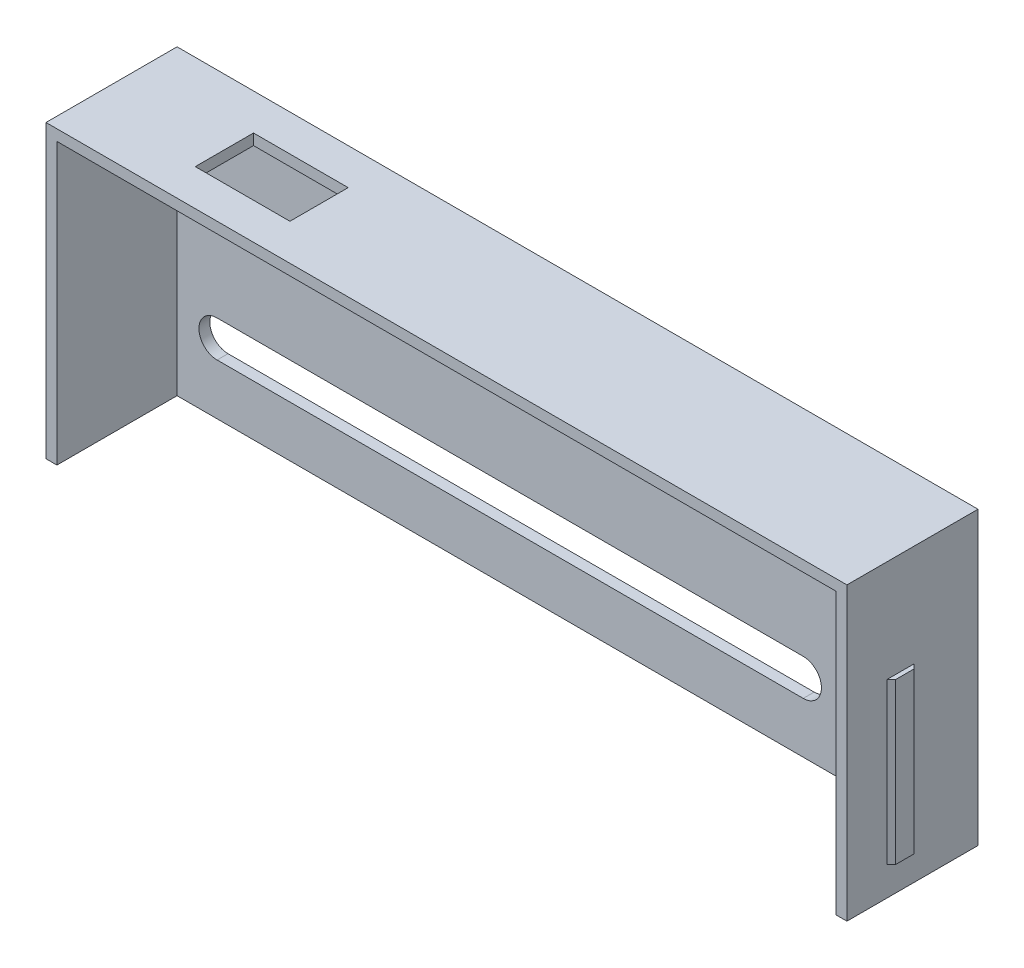
ISO-10303-21;
HEADER;
FILE_DESCRIPTION(('STEP AP214'),'2;1');
FILE_NAME('part.step','',(''),(''),'','','');
FILE_SCHEMA(('AUTOMOTIVE_DESIGN { 1 0 10303 214 1 1 1 1 }'));
ENDSEC;
DATA;
#1=APPLICATION_CONTEXT('core data for automotive mechanical design processes');
#2=APPLICATION_PROTOCOL_DEFINITION('international standard','automotive_design',2000,#1);
#3=PRODUCT_CONTEXT('',#1,'mechanical');
#4=PRODUCT('Part','Part','',(#3));
#5=PRODUCT_RELATED_PRODUCT_CATEGORY('part','',(#4));
#6=PRODUCT_DEFINITION_FORMATION('','',#4);
#7=PRODUCT_DEFINITION_CONTEXT('part definition',#1,'design');
#8=PRODUCT_DEFINITION('design','',#6,#7);
#9=PRODUCT_DEFINITION_SHAPE('','',#8);
#10=(LENGTH_UNIT() NAMED_UNIT(*) SI_UNIT(.MILLI.,.METRE.));
#11=(NAMED_UNIT(*) PLANE_ANGLE_UNIT() SI_UNIT($,.RADIAN.));
#12=(NAMED_UNIT(*) SI_UNIT($,.STERADIAN.) SOLID_ANGLE_UNIT());
#13=UNCERTAINTY_MEASURE_WITH_UNIT(LENGTH_MEASURE(1.E-05),#10,'distance_accuracy_value','');
#14=(GEOMETRIC_REPRESENTATION_CONTEXT(3) GLOBAL_UNCERTAINTY_ASSIGNED_CONTEXT((#13)) GLOBAL_UNIT_ASSIGNED_CONTEXT((#10,
#11,#12)) REPRESENTATION_CONTEXT('',''));
#15=CARTESIAN_POINT('',(0.,0.,0.));
#16=DIRECTION('',(0.,0.,1.));
#17=DIRECTION('',(1.,0.,0.));
#18=AXIS2_PLACEMENT_3D('',#15,#16,#17);
#19=CARTESIAN_POINT('',(109.999999403954,0.,17.9999992251396));
#20=DIRECTION('',(1.,0.,0.));
#21=DIRECTION('',(0.,0.,-1.));
#22=AXIS2_PLACEMENT_3D('',#19,#20,#21);
#23=PLANE('',#22);
#24=DIRECTION('',(0.,-1.,0.));
#25=VECTOR('',#24,1.);
#26=CARTESIAN_POINT('',(109.999999403954,26.0000005364418,8.79999995231628));
#27=LINE('',#26,#25);
#28=CARTESIAN_POINT('',(109.999999403954,26.0000005364418,8.79999995231628));
#29=VERTEX_POINT('',#28);
#30=CARTESIAN_POINT('',(109.999999403954,4.00000018998981,8.79999995231628));
#31=VERTEX_POINT('',#30);
#32=EDGE_CURVE('E278',#29,#31,#27,.T.);
#33=ORIENTED_EDGE('',*,*,#32,.T.);
#34=DIRECTION('',(0.,0.,1.));
#35=VECTOR('',#34,1.);
#36=CARTESIAN_POINT('',(109.999999403954,4.00000018998981,8.79999995231628));
#37=LINE('',#36,#35);
#38=CARTESIAN_POINT('',(109.999999403954,4.00000018998981,12.5000001862645));
#39=VERTEX_POINT('',#38);
#40=EDGE_CURVE('E288',#31,#39,#37,.T.);
#41=ORIENTED_EDGE('',*,*,#40,.T.);
#42=DIRECTION('',(0.,1.,0.));
#43=VECTOR('',#42,1.);
#44=CARTESIAN_POINT('',(109.999999403954,26.0000005364418,12.5000001862645));
#45=LINE('',#44,#43);
#46=CARTESIAN_POINT('',(109.999999403954,26.0000005364418,12.500000214763));
#47=VERTEX_POINT('',#46);
#48=EDGE_CURVE('E290',#39,#47,#45,.T.);
#49=ORIENTED_EDGE('',*,*,#48,.T.);
#50=DIRECTION('',(0.,0.,-1.));
#51=VECTOR('',#50,1.);
#52=CARTESIAN_POINT('',(109.999999403954,26.0000005364418,8.79999995231628));
#53=LINE('',#52,#51);
#54=EDGE_CURVE('E283',#47,#29,#53,.T.);
#55=ORIENTED_EDGE('',*,*,#54,.T.);
#56=EDGE_LOOP('',(#33,#41,#49,#55));
#57=FACE_BOUND('',#56,.T.);
#58=DIRECTION('',(0.,-1.,0.));
#59=VECTOR('',#58,1.);
#60=CARTESIAN_POINT('',(109.999999403954,0.,0.));
#61=LINE('',#60,#59);
#62=CARTESIAN_POINT('',(109.999999403954,39.9999991059303,0.));
#63=VERTEX_POINT('',#62);
#64=CARTESIAN_POINT('',(109.999999403954,0.,0.));
#65=VERTEX_POINT('',#64);
#66=EDGE_CURVE('E316',#63,#65,#61,.T.);
#67=ORIENTED_EDGE('',*,*,#66,.F.);
#68=DIRECTION('',(0.,0.,-1.));
#69=VECTOR('',#68,1.);
#70=CARTESIAN_POINT('',(109.999999403954,39.9999991059303,17.9999992251396));
#71=LINE('',#70,#69);
#72=CARTESIAN_POINT('',(109.999999403954,39.9999991059303,17.9999992251396));
#73=VERTEX_POINT('',#72);
#74=EDGE_CURVE('E352',#73,#63,#71,.T.);
#75=ORIENTED_EDGE('',*,*,#74,.F.);
#76=DIRECTION('',(0.,-1.,0.));
#77=VECTOR('',#76,1.);
#78=CARTESIAN_POINT('',(109.999999403954,0.,17.9999992251396));
#79=LINE('',#78,#77);
#80=CARTESIAN_POINT('',(109.999999403954,0.,17.9999992251396));
#81=VERTEX_POINT('',#80);
#82=EDGE_CURVE('E327',#73,#81,#79,.T.);
#83=ORIENTED_EDGE('',*,*,#82,.T.);
#84=DIRECTION('',(0.,0.,-1.));
#85=VECTOR('',#84,1.);
#86=CARTESIAN_POINT('',(109.999999403954,0.,17.9999992251396));
#87=LINE('',#86,#85);
#88=EDGE_CURVE('E341',#81,#65,#87,.T.);
#89=ORIENTED_EDGE('',*,*,#88,.T.);
#90=EDGE_LOOP('',(#67,#75,#83,#89));
#91=FACE_BOUND('',#90,.T.);
#92=ADVANCED_FACE('F43',(#57,#91),#23,.T.);
#93=CARTESIAN_POINT('',(109.999999403954,39.9999991059303,17.9999992251396));
#94=DIRECTION('',(0.,1.,0.));
#95=DIRECTION('',(0.,0.,1.));
#96=AXIS2_PLACEMENT_3D('',#93,#94,#95);
#97=PLANE('',#96);
#98=DIRECTION('',(0.,0.,-1.));
#99=VECTOR('',#98,1.);
#100=CARTESIAN_POINT('',(28.5000008121133,39.9999991059303,12.9999998454005));
#101=LINE('',#100,#99);
#102=CARTESIAN_POINT('',(28.5000008121133,39.9999991059303,12.9999998454005));
#103=VERTEX_POINT('',#102);
#104=CARTESIAN_POINT('',(28.5000008121133,39.9999991059303,4.99999984540045));
#105=VERTEX_POINT('',#104);
#106=EDGE_CURVE('E230',#103,#105,#101,.T.);
#107=ORIENTED_EDGE('',*,*,#106,.F.);
#108=DIRECTION('',(1.,0.,0.));
#109=VECTOR('',#108,1.);
#110=CARTESIAN_POINT('',(15.5000008121133,39.9999991059303,12.9999998454005));
#111=LINE('',#110,#109);
#112=CARTESIAN_POINT('',(15.5000008121133,39.9999991059303,12.9999998454005));
#113=VERTEX_POINT('',#112);
#114=EDGE_CURVE('E240',#113,#103,#111,.T.);
#115=ORIENTED_EDGE('',*,*,#114,.F.);
#116=DIRECTION('',(0.,0.,1.));
#117=VECTOR('',#116,1.);
#118=CARTESIAN_POINT('',(15.5000008121133,39.9999991059303,12.9999998454005));
#119=LINE('',#118,#117);
#120=CARTESIAN_POINT('',(15.5000008121133,39.9999991059303,4.99999984540045));
#121=VERTEX_POINT('',#120);
#122=EDGE_CURVE('E237',#121,#113,#119,.T.);
#123=ORIENTED_EDGE('',*,*,#122,.F.);
#124=DIRECTION('',(-1.,0.,0.));
#125=VECTOR('',#124,1.);
#126=CARTESIAN_POINT('',(15.5000008121133,39.9999991059303,4.99999984540045));
#127=LINE('',#126,#125);
#128=EDGE_CURVE('E234',#105,#121,#127,.T.);
#129=ORIENTED_EDGE('',*,*,#128,.F.);
#130=EDGE_LOOP('',(#107,#115,#123,#129));
#131=FACE_BOUND('',#130,.T.);
#132=DIRECTION('',(1.,0.,0.));
#133=VECTOR('',#132,1.);
#134=CARTESIAN_POINT('',(109.999999403954,39.9999991059303,0.));
#135=LINE('',#134,#133);
#136=CARTESIAN_POINT('',(0.,39.9999991059303,0.));
#137=VERTEX_POINT('',#136);
#138=EDGE_CURVE('E331',#137,#63,#135,.T.);
#139=ORIENTED_EDGE('',*,*,#138,.F.);
#140=DIRECTION('',(0.,0.,-1.));
#141=VECTOR('',#140,1.);
#142=CARTESIAN_POINT('',(0.,39.9999991059303,17.9999992251396));
#143=LINE('',#142,#141);
#144=CARTESIAN_POINT('',(0.,39.9999991059303,17.9999992251396));
#145=VERTEX_POINT('',#144);
#146=EDGE_CURVE('E355',#145,#137,#143,.T.);
#147=ORIENTED_EDGE('',*,*,#146,.F.);
#148=DIRECTION('',(1.,0.,0.));
#149=VECTOR('',#148,1.);
#150=CARTESIAN_POINT('',(109.999999403954,39.9999991059303,17.9999992251396));
#151=LINE('',#150,#149);
#152=EDGE_CURVE('E338',#145,#73,#151,.T.);
#153=ORIENTED_EDGE('',*,*,#152,.T.);
#154=ORIENTED_EDGE('',*,*,#74,.T.);
#155=EDGE_LOOP('',(#139,#147,#153,#154));
#156=FACE_BOUND('',#155,.T.);
#157=ADVANCED_FACE('F410',(#131,#156),#97,.T.);
#158=CARTESIAN_POINT('',(0.,0.,17.9999992251396));
#159=DIRECTION('',(-1.,0.,0.));
#160=DIRECTION('',(0.,0.,1.));
#161=AXIS2_PLACEMENT_3D('',#158,#159,#160);
#162=PLANE('',#161);
#163=DIRECTION('',(0.,-1.,0.));
#164=VECTOR('',#163,1.);
#165=CARTESIAN_POINT('',(0.,26.0000005364418,8.79999995231628));
#166=LINE('',#165,#164);
#167=CARTESIAN_POINT('',(0.,26.0000005364418,8.79999995231628));
#168=VERTEX_POINT('',#167);
#169=CARTESIAN_POINT('',(0.,4.00000018998981,8.79999995231628));
#170=VERTEX_POINT('',#169);
#171=EDGE_CURVE('E308',#168,#170,#166,.T.);
#172=ORIENTED_EDGE('',*,*,#171,.F.);
#173=DIRECTION('',(0.,0.,-1.));
#174=VECTOR('',#173,1.);
#175=CARTESIAN_POINT('',(0.,26.0000005364418,8.79999995231628));
#176=LINE('',#175,#174);
#177=CARTESIAN_POINT('',(0.,26.0000005364418,12.5000001862645));
#178=VERTEX_POINT('',#177);
#179=EDGE_CURVE('E313',#178,#168,#176,.T.);
#180=ORIENTED_EDGE('',*,*,#179,.F.);
#181=DIRECTION('',(0.,1.,0.));
#182=VECTOR('',#181,1.);
#183=CARTESIAN_POINT('',(0.,26.0000005364418,12.5000001862645));
#184=LINE('',#183,#182);
#185=CARTESIAN_POINT('',(0.,4.00000018998981,12.5000001862645));
#186=VERTEX_POINT('',#185);
#187=EDGE_CURVE('E322',#186,#178,#184,.T.);
#188=ORIENTED_EDGE('',*,*,#187,.F.);
#189=DIRECTION('',(0.,0.,1.));
#190=VECTOR('',#189,1.);
#191=CARTESIAN_POINT('',(0.,4.00000018998981,8.79999995231628));
#192=LINE('',#191,#190);
#193=EDGE_CURVE('E319',#170,#186,#192,.T.);
#194=ORIENTED_EDGE('',*,*,#193,.F.);
#195=EDGE_LOOP('',(#172,#180,#188,#194));
#196=FACE_BOUND('',#195,.T.);
#197=DIRECTION('',(0.,1.,0.));
#198=VECTOR('',#197,1.);
#199=CARTESIAN_POINT('',(0.,0.,0.));
#200=LINE('',#199,#198);
#201=CARTESIAN_POINT('',(0.,0.,0.));
#202=VERTEX_POINT('',#201);
#203=EDGE_CURVE('E347',#202,#137,#200,.T.);
#204=ORIENTED_EDGE('',*,*,#203,.F.);
#205=DIRECTION('',(0.,0.,-1.));
#206=VECTOR('',#205,1.);
#207=CARTESIAN_POINT('',(0.,0.,17.9999992251396));
#208=LINE('',#207,#206);
#209=CARTESIAN_POINT('',(0.,0.,17.9999992251396));
#210=VERTEX_POINT('',#209);
#211=EDGE_CURVE('E357',#210,#202,#208,.T.);
#212=ORIENTED_EDGE('',*,*,#211,.F.);
#213=DIRECTION('',(0.,1.,0.));
#214=VECTOR('',#213,1.);
#215=CARTESIAN_POINT('',(0.,0.,17.9999992251396));
#216=LINE('',#215,#214);
#217=EDGE_CURVE('E335',#210,#145,#216,.T.);
#218=ORIENTED_EDGE('',*,*,#217,.T.);
#219=ORIENTED_EDGE('',*,*,#146,.T.);
#220=EDGE_LOOP('',(#204,#212,#218,#219));
#221=FACE_BOUND('',#220,.T.);
#222=ADVANCED_FACE('F416',(#196,#221),#162,.T.);
#223=CARTESIAN_POINT('',(109.999999403954,0.,17.9999992251396));
#224=DIRECTION('',(0.,-1.,0.));
#225=DIRECTION('',(0.,0.,-1.));
#226=AXIS2_PLACEMENT_3D('',#223,#224,#225);
#227=PLANE('',#226);
#228=DIRECTION('',(0.,0.,1.));
#229=VECTOR('',#228,1.);
#230=CARTESIAN_POINT('',(108.499999403954,0.,-113.715653291896));
#231=LINE('',#230,#229);
#232=CARTESIAN_POINT('',(108.499999403954,0.,1.5));
#233=VERTEX_POINT('',#232);
#234=CARTESIAN_POINT('',(108.499999403954,0.,17.9999992251396));
#235=VERTEX_POINT('',#234);
#236=EDGE_CURVE('E270',#233,#235,#231,.T.);
#237=ORIENTED_EDGE('',*,*,#236,.F.);
#238=DIRECTION('',(-1.,0.,0.));
#239=VECTOR('',#238,1.);
#240=CARTESIAN_POINT('',(1.5,0.,1.5));
#241=LINE('',#240,#239);
#242=CARTESIAN_POINT('',(1.5,0.,1.50000000000002));
#243=VERTEX_POINT('',#242);
#244=EDGE_CURVE('E253',#233,#243,#241,.T.);
#245=ORIENTED_EDGE('',*,*,#244,.T.);
#246=DIRECTION('',(0.,0.,1.));
#247=VECTOR('',#246,1.);
#248=CARTESIAN_POINT('',(1.5,0.,-113.715653291896));
#249=LINE('',#248,#247);
#250=CARTESIAN_POINT('',(1.5,0.,17.9999992251396));
#251=VERTEX_POINT('',#250);
#252=EDGE_CURVE('E272',#243,#251,#249,.T.);
#253=ORIENTED_EDGE('',*,*,#252,.T.);
#254=DIRECTION('',(-1.,0.,0.));
#255=VECTOR('',#254,1.);
#256=CARTESIAN_POINT('',(109.999999403954,0.,17.9999992251396));
#257=LINE('',#256,#255);
#258=EDGE_CURVE('E330',#251,#210,#257,.T.);
#259=ORIENTED_EDGE('',*,*,#258,.T.);
#260=ORIENTED_EDGE('',*,*,#211,.T.);
#261=DIRECTION('',(-1.,0.,0.));
#262=VECTOR('',#261,1.);
#263=CARTESIAN_POINT('',(109.999999403954,0.,0.));
#264=LINE('',#263,#262);
#265=EDGE_CURVE('E344',#65,#202,#264,.T.);
#266=ORIENTED_EDGE('',*,*,#265,.F.);
#267=ORIENTED_EDGE('',*,*,#88,.F.);
#268=EDGE_CURVE('E332',#81,#235,#257,.T.);
#269=ORIENTED_EDGE('',*,*,#268,.T.);
#270=EDGE_LOOP('',(#237,#245,#253,#259,#260,#266,#267,#269));
#271=FACE_BOUND('',#270,.T.);
#272=ADVANCED_FACE('F421',(#271),#227,.T.);
#273=CARTESIAN_POINT('',(0.,0.,17.9999992251396));
#274=DIRECTION('',(0.,0.,1.));
#275=DIRECTION('',(0.,-1.,0.));
#276=AXIS2_PLACEMENT_3D('',#273,#274,#275);
#277=PLANE('',#276);
#278=DIRECTION('',(0.,1.,0.));
#279=VECTOR('',#278,1.);
#280=CARTESIAN_POINT('',(108.499999403954,38.4999991059303,17.9999992251396));
#281=LINE('',#280,#279);
#282=CARTESIAN_POINT('',(108.499999403954,38.4999991059303,17.9999992251396));
#283=VERTEX_POINT('',#282);
#284=EDGE_CURVE('E265',#235,#283,#281,.T.);
#285=ORIENTED_EDGE('',*,*,#284,.F.);
#286=ORIENTED_EDGE('',*,*,#268,.F.);
#287=ORIENTED_EDGE('',*,*,#82,.F.);
#288=ORIENTED_EDGE('',*,*,#152,.F.);
#289=ORIENTED_EDGE('',*,*,#217,.F.);
#290=ORIENTED_EDGE('',*,*,#258,.F.);
#291=DIRECTION('',(0.,-1.,0.));
#292=VECTOR('',#291,1.);
#293=CARTESIAN_POINT('',(1.5,0.,17.9999992251396));
#294=LINE('',#293,#292);
#295=CARTESIAN_POINT('',(1.5,38.4999991059303,17.9999992251396));
#296=VERTEX_POINT('',#295);
#297=EDGE_CURVE('E263',#296,#251,#294,.T.);
#298=ORIENTED_EDGE('',*,*,#297,.F.);
#299=DIRECTION('',(-1.,0.,0.));
#300=VECTOR('',#299,1.);
#301=CARTESIAN_POINT('',(1.5,38.4999991059303,17.9999992251396));
#302=LINE('',#301,#300);
#303=EDGE_CURVE('E246',#283,#296,#302,.T.);
#304=ORIENTED_EDGE('',*,*,#303,.F.);
#305=EDGE_LOOP('',(#285,#286,#287,#288,#289,#290,#298,#304));
#306=FACE_BOUND('',#305,.T.);
#307=ADVANCED_FACE('F459',(#306),#277,.T.);
#308=CARTESIAN_POINT('',(0.,0.,0.));
#309=DIRECTION('',(0.,0.,1.));
#310=DIRECTION('',(0.,-1.,0.));
#311=AXIS2_PLACEMENT_3D('',#308,#309,#310);
#312=PLANE('',#311);
#313=DIRECTION('',(-1.,0.,0.));
#314=VECTOR('',#313,1.);
#315=CARTESIAN_POINT('',(87.500003632158,7.00000021606684,0.));
#316=LINE('',#315,#314);
#317=CARTESIAN_POINT('',(87.500003632158,7.00000021606684,0.));
#318=VERTEX_POINT('',#317);
#319=CARTESIAN_POINT('',(7.00000021606683,7.00000021606684,0.));
#320=VERTEX_POINT('',#319);
#321=EDGE_CURVE('E216',#318,#320,#316,.T.);
#322=ORIENTED_EDGE('',*,*,#321,.F.);
#323=CARTESIAN_POINT('',(87.500003632158,9.50000016018748,0.));
#324=DIRECTION('',(0.,0.,-1.));
#325=DIRECTION('',(0.,1.,0.));
#326=AXIS2_PLACEMENT_3D('',#323,#324,#325);
#327=CIRCLE('',#326,2.49999994412065);
#328=CARTESIAN_POINT('',(87.500003632158,12.0000001043081,0.));
#329=VERTEX_POINT('',#328);
#330=EDGE_CURVE('E59',#329,#318,#327,.T.);
#331=ORIENTED_EDGE('',*,*,#330,.F.);
#332=DIRECTION('',(1.,0.,0.));
#333=VECTOR('',#332,1.);
#334=CARTESIAN_POINT('',(87.500003632158,12.0000001043081,0.));
#335=LINE('',#334,#333);
#336=CARTESIAN_POINT('',(7.00000021606683,12.0000001043081,0.));
#337=VERTEX_POINT('',#336);
#338=EDGE_CURVE('E223',#337,#329,#335,.T.);
#339=ORIENTED_EDGE('',*,*,#338,.F.);
#340=CARTESIAN_POINT('',(7.00000021606683,9.50000016018748,0.));
#341=DIRECTION('',(0.,0.,-1.));
#342=DIRECTION('',(0.,1.,0.));
#343=AXIS2_PLACEMENT_3D('',#340,#341,#342);
#344=CIRCLE('',#343,2.49999994412065);
#345=EDGE_CURVE('E207',#320,#337,#344,.T.);
#346=ORIENTED_EDGE('',*,*,#345,.F.);
#347=EDGE_LOOP('',(#322,#331,#339,#346));
#348=FACE_BOUND('',#347,.T.);
#349=ORIENTED_EDGE('',*,*,#66,.T.);
#350=ORIENTED_EDGE('',*,*,#265,.T.);
#351=ORIENTED_EDGE('',*,*,#203,.T.);
#352=ORIENTED_EDGE('',*,*,#138,.T.);
#353=EDGE_LOOP('',(#349,#350,#351,#352));
#354=FACE_BOUND('',#353,.T.);
#355=ADVANCED_FACE('F220',(#348,#354),#312,.F.);
#356=CARTESIAN_POINT('',(-0.600000028498471,4.00000018998981,8.79999995231628));
#357=DIRECTION('',(0.,1.,0.));
#358=DIRECTION('',(0.,0.,1.));
#359=AXIS2_PLACEMENT_3D('',#356,#357,#358);
#360=PLANE('',#359);
#361=DIRECTION('',(0.,0.,1.));
#362=VECTOR('',#361,1.);
#363=CARTESIAN_POINT('',(-0.600000028498471,4.00000018998981,8.79999995231628));
#364=LINE('',#363,#362);
#365=CARTESIAN_POINT('',(-0.600000028498471,4.00000018998981,9.39999995231627));
#366=VERTEX_POINT('',#365);
#367=CARTESIAN_POINT('',(-0.600000028498471,4.00000018998981,11.9000001862645));
#368=VERTEX_POINT('',#367);
#369=EDGE_CURVE('E309',#366,#368,#364,.T.);
#370=ORIENTED_EDGE('',*,*,#369,.F.);
#371=DIRECTION('',(0.707106781186556,0.,-0.707106781186539));
#372=VECTOR('',#371,1.);
#373=CARTESIAN_POINT('',(-0.600000028498471,4.00000018998981,9.39999995231627));
#374=LINE('',#373,#372);
#375=EDGE_CURVE('E367',#366,#170,#374,.T.);
#376=ORIENTED_EDGE('',*,*,#375,.T.);
#377=ORIENTED_EDGE('',*,*,#193,.T.);
#378=DIRECTION('',(-0.707106781186556,0.,-0.707106781186539));
#379=VECTOR('',#378,1.);
#380=CARTESIAN_POINT('',(-0.600000028498471,4.00000018998981,11.9000001862645));
#381=LINE('',#380,#379);
#382=EDGE_CURVE('E365',#186,#368,#381,.T.);
#383=ORIENTED_EDGE('',*,*,#382,.T.);
#384=EDGE_LOOP('',(#370,#376,#377,#383));
#385=FACE_BOUND('',#384,.T.);
#386=ADVANCED_FACE('F451',(#385),#360,.F.);
#387=CARTESIAN_POINT('',(-0.600000028498471,26.0000005364418,8.79999995231628));
#388=DIRECTION('',(0.,-1.,0.));
#389=DIRECTION('',(0.,0.,-1.));
#390=AXIS2_PLACEMENT_3D('',#387,#388,#389);
#391=PLANE('',#390);
#392=ORIENTED_EDGE('',*,*,#179,.T.);
#393=DIRECTION('',(-0.707106781186556,0.,0.707106781186539));
#394=VECTOR('',#393,1.);
#395=CARTESIAN_POINT('',(-0.600000028498471,26.0000005364418,9.39999995231627));
#396=LINE('',#395,#394);
#397=CARTESIAN_POINT('',(-0.600000028498471,26.0000005364418,9.39999995231627));
#398=VERTEX_POINT('',#397);
#399=EDGE_CURVE('E371',#168,#398,#396,.T.);
#400=ORIENTED_EDGE('',*,*,#399,.T.);
#401=DIRECTION('',(0.,0.,-1.));
#402=VECTOR('',#401,1.);
#403=CARTESIAN_POINT('',(-0.600000028498471,26.0000005364418,8.79999995231628));
#404=LINE('',#403,#402);
#405=CARTESIAN_POINT('',(-0.600000028498471,26.0000005364418,11.9000001862645));
#406=VERTEX_POINT('',#405);
#407=EDGE_CURVE('E312',#406,#398,#404,.T.);
#408=ORIENTED_EDGE('',*,*,#407,.F.);
#409=DIRECTION('',(0.707106781186556,0.,0.707106781186539));
#410=VECTOR('',#409,1.);
#411=CARTESIAN_POINT('',(-0.600000028498471,26.0000005364418,11.9000001862645));
#412=LINE('',#411,#410);
#413=EDGE_CURVE('E369',#406,#178,#412,.T.);
#414=ORIENTED_EDGE('',*,*,#413,.T.);
#415=EDGE_LOOP('',(#392,#400,#408,#414));
#416=FACE_BOUND('',#415,.T.);
#417=ADVANCED_FACE('F436',(#416),#391,.F.);
#418=CARTESIAN_POINT('',(-0.600000028498471,0.,0.));
#419=DIRECTION('',(-1.,0.,0.));
#420=DIRECTION('',(0.,0.,1.));
#421=AXIS2_PLACEMENT_3D('',#418,#419,#420);
#422=PLANE('',#421);
#423=ORIENTED_EDGE('',*,*,#407,.T.);
#424=DIRECTION('',(0.,-1.,0.));
#425=VECTOR('',#424,1.);
#426=CARTESIAN_POINT('',(-0.600000028498471,4.00000018998981,9.39999995231627));
#427=LINE('',#426,#425);
#428=EDGE_CURVE('E362',#398,#366,#427,.T.);
#429=ORIENTED_EDGE('',*,*,#428,.T.);
#430=ORIENTED_EDGE('',*,*,#369,.T.);
#431=DIRECTION('',(0.,1.,0.));
#432=VECTOR('',#431,1.);
#433=CARTESIAN_POINT('',(-0.600000028498471,26.0000005364418,11.9000001862645));
#434=LINE('',#433,#432);
#435=EDGE_CURVE('E354',#368,#406,#434,.T.);
#436=ORIENTED_EDGE('',*,*,#435,.T.);
#437=EDGE_LOOP('',(#423,#429,#430,#436));
#438=FACE_BOUND('',#437,.T.);
#439=ADVANCED_FACE('F428',(#438),#422,.T.);
#440=CARTESIAN_POINT('',(-0.600000028498471,0.,9.39999995231627));
#441=DIRECTION('',(-0.707106781186539,0.,-0.707106781186556));
#442=DIRECTION('',(0.,1.,0.));
#443=AXIS2_PLACEMENT_3D('',#440,#441,#442);
#444=PLANE('',#443);
#445=ORIENTED_EDGE('',*,*,#399,.F.);
#446=ORIENTED_EDGE('',*,*,#171,.T.);
#447=ORIENTED_EDGE('',*,*,#375,.F.);
#448=ORIENTED_EDGE('',*,*,#428,.F.);
#449=EDGE_LOOP('',(#445,#446,#447,#448));
#450=FACE_BOUND('',#449,.T.);
#451=ADVANCED_FACE('F424',(#450),#444,.T.);
#452=CARTESIAN_POINT('',(-0.600000028498471,0.,11.9000001862645));
#453=DIRECTION('',(-0.707106781186539,0.,0.707106781186556));
#454=DIRECTION('',(0.,-1.,0.));
#455=AXIS2_PLACEMENT_3D('',#452,#453,#454);
#456=PLANE('',#455);
#457=ORIENTED_EDGE('',*,*,#382,.F.);
#458=ORIENTED_EDGE('',*,*,#187,.T.);
#459=ORIENTED_EDGE('',*,*,#413,.F.);
#460=ORIENTED_EDGE('',*,*,#435,.F.);
#461=EDGE_LOOP('',(#457,#458,#459,#460));
#462=FACE_BOUND('',#461,.T.);
#463=ADVANCED_FACE('F46',(#462),#456,.T.);
#464=CARTESIAN_POINT('',(110.599999432452,4.00000018998981,8.79999995231628));
#465=DIRECTION('',(0.,1.,0.));
#466=DIRECTION('',(0.,0.,1.));
#467=AXIS2_PLACEMENT_3D('',#464,#465,#466);
#468=PLANE('',#467);
#469=DIRECTION('',(0.,0.,1.));
#470=VECTOR('',#469,1.);
#471=CARTESIAN_POINT('',(110.599999432452,4.00000018998981,8.79999995231628));
#472=LINE('',#471,#470);
#473=CARTESIAN_POINT('',(110.599999432452,4.00000018998981,9.39999995231627));
#474=VERTEX_POINT('',#473);
#475=CARTESIAN_POINT('',(110.599999432452,4.00000018998981,11.9000001862645));
#476=VERTEX_POINT('',#475);
#477=EDGE_CURVE('E279',#474,#476,#472,.T.);
#478=ORIENTED_EDGE('',*,*,#477,.T.);
#479=DIRECTION('',(0.707106781186556,0.,-0.707106781186539));
#480=VECTOR('',#479,1.);
#481=CARTESIAN_POINT('',(110.599999432452,4.00000018998981,11.9000001862645));
#482=LINE('',#481,#480);
#483=EDGE_CURVE('E296',#39,#476,#482,.T.);
#484=ORIENTED_EDGE('',*,*,#483,.F.);
#485=ORIENTED_EDGE('',*,*,#40,.F.);
#486=DIRECTION('',(-0.707106781186556,0.,-0.707106781186539));
#487=VECTOR('',#486,1.);
#488=CARTESIAN_POINT('',(110.599999432452,4.00000018998981,9.39999995231627));
#489=LINE('',#488,#487);
#490=EDGE_CURVE('E299',#474,#31,#489,.T.);
#491=ORIENTED_EDGE('',*,*,#490,.F.);
#492=EDGE_LOOP('',(#478,#484,#485,#491));
#493=FACE_BOUND('',#492,.T.);
#494=ADVANCED_FACE('F434',(#493),#468,.F.);
#495=CARTESIAN_POINT('',(110.599999432452,26.0000005364418,8.79999995231628));
#496=DIRECTION('',(0.,-1.,0.));
#497=DIRECTION('',(0.,0.,-1.));
#498=AXIS2_PLACEMENT_3D('',#495,#496,#497);
#499=PLANE('',#498);
#500=ORIENTED_EDGE('',*,*,#54,.F.);
#501=DIRECTION('',(-0.707106781186556,0.,0.707106781186539));
#502=VECTOR('',#501,1.);
#503=CARTESIAN_POINT('',(110.599999432452,26.0000005364418,11.9000001862645));
#504=LINE('',#503,#502);
#505=CARTESIAN_POINT('',(110.599999432452,26.0000005364418,11.9000001862645));
#506=VERTEX_POINT('',#505);
#507=EDGE_CURVE('E302',#506,#47,#504,.T.);
#508=ORIENTED_EDGE('',*,*,#507,.F.);
#509=DIRECTION('',(0.,0.,-1.));
#510=VECTOR('',#509,1.);
#511=CARTESIAN_POINT('',(110.599999432452,26.0000005364418,8.79999995231628));
#512=LINE('',#511,#510);
#513=CARTESIAN_POINT('',(110.599999432452,26.0000005364418,9.39999995231627));
#514=VERTEX_POINT('',#513);
#515=EDGE_CURVE('E282',#506,#514,#512,.T.);
#516=ORIENTED_EDGE('',*,*,#515,.T.);
#517=DIRECTION('',(0.707106781186556,0.,0.707106781186539));
#518=VECTOR('',#517,1.);
#519=CARTESIAN_POINT('',(110.599999432452,26.0000005364418,9.39999995231627));
#520=LINE('',#519,#518);
#521=EDGE_CURVE('E305',#29,#514,#520,.T.);
#522=ORIENTED_EDGE('',*,*,#521,.F.);
#523=EDGE_LOOP('',(#500,#508,#516,#522));
#524=FACE_BOUND('',#523,.T.);
#525=ADVANCED_FACE('F512',(#524),#499,.F.);
#526=CARTESIAN_POINT('',(110.599999432452,0.,0.));
#527=DIRECTION('',(1.,0.,0.));
#528=DIRECTION('',(0.,0.,1.));
#529=AXIS2_PLACEMENT_3D('',#526,#527,#528);
#530=PLANE('',#529);
#531=ORIENTED_EDGE('',*,*,#515,.F.);
#532=DIRECTION('',(0.,1.,0.));
#533=VECTOR('',#532,1.);
#534=CARTESIAN_POINT('',(110.599999432452,26.0000005364418,11.9000001862645));
#535=LINE('',#534,#533);
#536=EDGE_CURVE('E286',#476,#506,#535,.T.);
#537=ORIENTED_EDGE('',*,*,#536,.F.);
#538=ORIENTED_EDGE('',*,*,#477,.F.);
#539=DIRECTION('',(0.,-1.,0.));
#540=VECTOR('',#539,1.);
#541=CARTESIAN_POINT('',(110.599999432452,4.00000018998981,9.39999995231627));
#542=LINE('',#541,#540);
#543=EDGE_CURVE('E294',#514,#474,#542,.T.);
#544=ORIENTED_EDGE('',*,*,#543,.F.);
#545=EDGE_LOOP('',(#531,#537,#538,#544));
#546=FACE_BOUND('',#545,.T.);
#547=ADVANCED_FACE('F508',(#546),#530,.T.);
#548=CARTESIAN_POINT('',(110.599999432452,0.,9.39999995231627));
#549=DIRECTION('',(0.707106781186539,0.,-0.707106781186556));
#550=DIRECTION('',(0.,1.,0.));
#551=AXIS2_PLACEMENT_3D('',#548,#549,#550);
#552=PLANE('',#551);
#553=ORIENTED_EDGE('',*,*,#521,.T.);
#554=ORIENTED_EDGE('',*,*,#543,.T.);
#555=ORIENTED_EDGE('',*,*,#490,.T.);
#556=ORIENTED_EDGE('',*,*,#32,.F.);
#557=EDGE_LOOP('',(#553,#554,#555,#556));
#558=FACE_BOUND('',#557,.T.);
#559=ADVANCED_FACE('F511',(#558),#552,.T.);
#560=CARTESIAN_POINT('',(110.599999432452,0.,11.9000001862645));
#561=DIRECTION('',(0.707106781186539,0.,0.707106781186556));
#562=DIRECTION('',(0.,-1.,0.));
#563=AXIS2_PLACEMENT_3D('',#560,#561,#562);
#564=PLANE('',#563);
#565=ORIENTED_EDGE('',*,*,#483,.T.);
#566=ORIENTED_EDGE('',*,*,#536,.T.);
#567=ORIENTED_EDGE('',*,*,#507,.T.);
#568=ORIENTED_EDGE('',*,*,#48,.F.);
#569=EDGE_LOOP('',(#565,#566,#567,#568));
#570=FACE_BOUND('',#569,.T.);
#571=ADVANCED_FACE('F506',(#570),#564,.T.);
#572=CARTESIAN_POINT('',(1.5,38.4999991059303,-113.715653291896));
#573=DIRECTION('',(0.,1.,0.));
#574=DIRECTION('',(0.,0.,1.));
#575=AXIS2_PLACEMENT_3D('',#572,#573,#574);
#576=PLANE('',#575);
#577=DIRECTION('',(1.,0.,0.));
#578=VECTOR('',#577,1.);
#579=CARTESIAN_POINT('',(1.5,38.4999991059303,12.9999998454005));
#580=LINE('',#579,#578);
#581=CARTESIAN_POINT('',(15.5000008121133,38.4999991059303,12.9999998454005));
#582=VERTEX_POINT('',#581);
#583=CARTESIAN_POINT('',(28.5000008121133,38.4999991059303,12.9999998454005));
#584=VERTEX_POINT('',#583);
#585=EDGE_CURVE('E379',#582,#584,#580,.T.);
#586=ORIENTED_EDGE('',*,*,#585,.T.);
#587=DIRECTION('',(0.,0.,-1.));
#588=VECTOR('',#587,1.);
#589=CARTESIAN_POINT('',(28.5000008121133,38.4999991059303,-113.715653291896));
#590=LINE('',#589,#588);
#591=CARTESIAN_POINT('',(28.5000008121133,38.4999991059303,4.99999984540045));
#592=VERTEX_POINT('',#591);
#593=EDGE_CURVE('E382',#584,#592,#590,.T.);
#594=ORIENTED_EDGE('',*,*,#593,.T.);
#595=DIRECTION('',(-1.,0.,0.));
#596=VECTOR('',#595,1.);
#597=CARTESIAN_POINT('',(1.49999999999998,38.4999991059303,4.99999984540045));
#598=LINE('',#597,#596);
#599=CARTESIAN_POINT('',(15.5000008121133,38.4999991059303,4.99999984540045));
#600=VERTEX_POINT('',#599);
#601=EDGE_CURVE('E373',#592,#600,#598,.T.);
#602=ORIENTED_EDGE('',*,*,#601,.T.);
#603=DIRECTION('',(0.,0.,1.));
#604=VECTOR('',#603,1.);
#605=CARTESIAN_POINT('',(15.5000008121133,38.4999991059303,-113.715653291896));
#606=LINE('',#605,#604);
#607=EDGE_CURVE('E376',#600,#582,#606,.T.);
#608=ORIENTED_EDGE('',*,*,#607,.T.);
#609=EDGE_LOOP('',(#586,#594,#602,#608));
#610=FACE_BOUND('',#609,.T.);
#611=DIRECTION('',(1.,0.,0.));
#612=VECTOR('',#611,1.);
#613=CARTESIAN_POINT('',(1.5,38.4999991059303,1.50000000000002));
#614=LINE('',#613,#612);
#615=CARTESIAN_POINT('',(1.5,38.4999991059303,1.50000000000002));
#616=VERTEX_POINT('',#615);
#617=CARTESIAN_POINT('',(108.499999403954,38.4999991059303,1.50000000000002));
#618=VERTEX_POINT('',#617);
#619=EDGE_CURVE('E259',#616,#618,#614,.T.);
#620=ORIENTED_EDGE('',*,*,#619,.T.);
#621=DIRECTION('',(0.,0.,1.));
#622=VECTOR('',#621,1.);
#623=CARTESIAN_POINT('',(108.499999403954,38.4999991059303,-113.715653291896));
#624=LINE('',#623,#622);
#625=EDGE_CURVE('E257',#618,#283,#624,.T.);
#626=ORIENTED_EDGE('',*,*,#625,.T.);
#627=ORIENTED_EDGE('',*,*,#303,.T.);
#628=DIRECTION('',(0.,0.,1.));
#629=VECTOR('',#628,1.);
#630=CARTESIAN_POINT('',(1.5,38.4999991059303,-113.715653291896));
#631=LINE('',#630,#629);
#632=EDGE_CURVE('E268',#616,#296,#631,.T.);
#633=ORIENTED_EDGE('',*,*,#632,.F.);
#634=EDGE_LOOP('',(#620,#626,#627,#633));
#635=FACE_BOUND('',#634,.T.);
#636=ADVANCED_FACE('F485',(#610,#635),#576,.F.);
#637=CARTESIAN_POINT('',(108.499999403954,38.4999991059303,-113.715653291896));
#638=DIRECTION('',(1.,0.,0.));
#639=DIRECTION('',(0.,0.,-1.));
#640=AXIS2_PLACEMENT_3D('',#637,#638,#639);
#641=PLANE('',#640);
#642=DIRECTION('',(0.,-1.,0.));
#643=VECTOR('',#642,1.);
#644=CARTESIAN_POINT('',(108.499999403954,38.4999991059303,1.50000000000002));
#645=LINE('',#644,#643);
#646=EDGE_CURVE('E256',#618,#233,#645,.T.);
#647=ORIENTED_EDGE('',*,*,#646,.T.);
#648=ORIENTED_EDGE('',*,*,#236,.T.);
#649=ORIENTED_EDGE('',*,*,#284,.T.);
#650=ORIENTED_EDGE('',*,*,#625,.F.);
#651=EDGE_LOOP('',(#647,#648,#649,#650));
#652=FACE_BOUND('',#651,.T.);
#653=ADVANCED_FACE('F476',(#652),#641,.F.);
#654=CARTESIAN_POINT('',(1.5,0.,-113.715653291896));
#655=DIRECTION('',(-1.,0.,0.));
#656=DIRECTION('',(0.,0.,1.));
#657=AXIS2_PLACEMENT_3D('',#654,#655,#656);
#658=PLANE('',#657);
#659=DIRECTION('',(0.,1.,0.));
#660=VECTOR('',#659,1.);
#661=CARTESIAN_POINT('',(1.5,0.,1.5));
#662=LINE('',#661,#660);
#663=EDGE_CURVE('E261',#243,#616,#662,.T.);
#664=ORIENTED_EDGE('',*,*,#663,.T.);
#665=ORIENTED_EDGE('',*,*,#632,.T.);
#666=ORIENTED_EDGE('',*,*,#297,.T.);
#667=ORIENTED_EDGE('',*,*,#252,.F.);
#668=EDGE_LOOP('',(#664,#665,#666,#667));
#669=FACE_BOUND('',#668,.T.);
#670=ADVANCED_FACE('F487',(#669),#658,.F.);
#671=CARTESIAN_POINT('',(0.,0.,1.5));
#672=DIRECTION('',(0.,0.,1.));
#673=DIRECTION('',(0.,-1.,0.));
#674=AXIS2_PLACEMENT_3D('',#671,#672,#673);
#675=PLANE('',#674);
#676=CARTESIAN_POINT('',(87.500003632158,9.50000016018748,1.5));
#677=DIRECTION('',(0.,0.,1.));
#678=DIRECTION('',(0.,-1.,0.));
#679=AXIS2_PLACEMENT_3D('',#676,#677,#678);
#680=CIRCLE('',#679,2.49999994412065);
#681=CARTESIAN_POINT('',(87.500003632158,7.00000021606684,1.5));
#682=VERTEX_POINT('',#681);
#683=CARTESIAN_POINT('',(87.500003632158,12.0000001043081,1.5));
#684=VERTEX_POINT('',#683);
#685=EDGE_CURVE('E12',#682,#684,#680,.T.);
#686=ORIENTED_EDGE('',*,*,#685,.F.);
#687=DIRECTION('',(1.,0.,0.));
#688=VECTOR('',#687,1.);
#689=CARTESIAN_POINT('',(0.,7.00000021606684,1.5));
#690=LINE('',#689,#688);
#691=CARTESIAN_POINT('',(7.00000021606683,7.00000021606684,1.5));
#692=VERTEX_POINT('',#691);
#693=EDGE_CURVE('E385',#692,#682,#690,.T.);
#694=ORIENTED_EDGE('',*,*,#693,.F.);
#695=CARTESIAN_POINT('',(7.00000021606683,9.50000016018748,1.5));
#696=DIRECTION('',(0.,0.,1.));
#697=DIRECTION('',(0.,-1.,0.));
#698=AXIS2_PLACEMENT_3D('',#695,#696,#697);
#699=CIRCLE('',#698,2.49999994412065);
#700=CARTESIAN_POINT('',(7.00000021606683,12.0000001043081,1.5));
#701=VERTEX_POINT('',#700);
#702=EDGE_CURVE('E210',#701,#692,#699,.T.);
#703=ORIENTED_EDGE('',*,*,#702,.F.);
#704=DIRECTION('',(-1.,0.,0.));
#705=VECTOR('',#704,1.);
#706=CARTESIAN_POINT('',(0.,12.0000001043081,1.50000000000001));
#707=LINE('',#706,#705);
#708=EDGE_CURVE('E52',#684,#701,#707,.T.);
#709=ORIENTED_EDGE('',*,*,#708,.F.);
#710=EDGE_LOOP('',(#686,#694,#703,#709));
#711=FACE_BOUND('',#710,.T.);
#712=ORIENTED_EDGE('',*,*,#619,.F.);
#713=ORIENTED_EDGE('',*,*,#663,.F.);
#714=ORIENTED_EDGE('',*,*,#244,.F.);
#715=ORIENTED_EDGE('',*,*,#646,.F.);
#716=EDGE_LOOP('',(#712,#713,#714,#715));
#717=FACE_BOUND('',#716,.T.);
#718=ADVANCED_FACE('F393',(#711,#717),#675,.T.);
#719=CARTESIAN_POINT('',(28.5000008121133,0.,12.9999998454005));
#720=DIRECTION('',(1.,0.,0.));
#721=DIRECTION('',(0.,0.,-1.));
#722=AXIS2_PLACEMENT_3D('',#719,#720,#721);
#723=PLANE('',#722);
#724=DIRECTION('',(0.,1.,0.));
#725=VECTOR('',#724,1.);
#726=CARTESIAN_POINT('',(28.5000008121133,0.,12.9999998454005));
#727=LINE('',#726,#725);
#728=EDGE_CURVE('E244',#584,#103,#727,.T.);
#729=ORIENTED_EDGE('',*,*,#728,.T.);
#730=ORIENTED_EDGE('',*,*,#106,.T.);
#731=DIRECTION('',(0.,1.,0.));
#732=VECTOR('',#731,1.);
#733=CARTESIAN_POINT('',(28.5000008121133,0.,4.99999984540045));
#734=LINE('',#733,#732);
#735=EDGE_CURVE('E243',#592,#105,#734,.T.);
#736=ORIENTED_EDGE('',*,*,#735,.F.);
#737=ORIENTED_EDGE('',*,*,#593,.F.);
#738=EDGE_LOOP('',(#729,#730,#736,#737));
#739=FACE_BOUND('',#738,.T.);
#740=ADVANCED_FACE('F491',(#739),#723,.F.);
#741=CARTESIAN_POINT('',(15.5000008121133,0.,12.9999998454005));
#742=DIRECTION('',(0.,0.,1.));
#743=DIRECTION('',(1.,0.,0.));
#744=AXIS2_PLACEMENT_3D('',#741,#742,#743);
#745=PLANE('',#744);
#746=DIRECTION('',(0.,1.,0.));
#747=VECTOR('',#746,1.);
#748=CARTESIAN_POINT('',(15.5000008121133,0.,12.9999998454005));
#749=LINE('',#748,#747);
#750=EDGE_CURVE('E247',#582,#113,#749,.T.);
#751=ORIENTED_EDGE('',*,*,#750,.T.);
#752=ORIENTED_EDGE('',*,*,#114,.T.);
#753=ORIENTED_EDGE('',*,*,#728,.F.);
#754=ORIENTED_EDGE('',*,*,#585,.F.);
#755=EDGE_LOOP('',(#751,#752,#753,#754));
#756=FACE_BOUND('',#755,.T.);
#757=ADVANCED_FACE('F497',(#756),#745,.F.);
#758=CARTESIAN_POINT('',(15.5000008121133,0.,12.9999998454005));
#759=DIRECTION('',(-1.,0.,0.));
#760=DIRECTION('',(0.,0.,1.));
#761=AXIS2_PLACEMENT_3D('',#758,#759,#760);
#762=PLANE('',#761);
#763=DIRECTION('',(0.,1.,0.));
#764=VECTOR('',#763,1.);
#765=CARTESIAN_POINT('',(15.5000008121133,0.,4.99999984540045));
#766=LINE('',#765,#764);
#767=EDGE_CURVE('E249',#600,#121,#766,.T.);
#768=ORIENTED_EDGE('',*,*,#767,.T.);
#769=ORIENTED_EDGE('',*,*,#122,.T.);
#770=ORIENTED_EDGE('',*,*,#750,.F.);
#771=ORIENTED_EDGE('',*,*,#607,.F.);
#772=EDGE_LOOP('',(#768,#769,#770,#771));
#773=FACE_BOUND('',#772,.T.);
#774=ADVANCED_FACE('F404',(#773),#762,.F.);
#775=CARTESIAN_POINT('',(15.5000008121133,0.,4.99999984540045));
#776=DIRECTION('',(0.,0.,-1.));
#777=DIRECTION('',(-1.,0.,0.));
#778=AXIS2_PLACEMENT_3D('',#775,#776,#777);
#779=PLANE('',#778);
#780=ORIENTED_EDGE('',*,*,#735,.T.);
#781=ORIENTED_EDGE('',*,*,#128,.T.);
#782=ORIENTED_EDGE('',*,*,#767,.F.);
#783=ORIENTED_EDGE('',*,*,#601,.F.);
#784=EDGE_LOOP('',(#780,#781,#782,#783));
#785=FACE_BOUND('',#784,.T.);
#786=ADVANCED_FACE('F397',(#785),#779,.F.);
#787=CARTESIAN_POINT('',(87.500003632158,9.50000016018748,17.9999992251396));
#788=DIRECTION('',(0.,0.,-1.));
#789=DIRECTION('',(0.,1.,0.));
#790=AXIS2_PLACEMENT_3D('',#787,#788,#789);
#791=CYLINDRICAL_SURFACE('',#790,2.49999994412065);
#792=ORIENTED_EDGE('',*,*,#685,.T.);
#793=DIRECTION('',(0.,0.,-1.));
#794=VECTOR('',#793,1.);
#795=CARTESIAN_POINT('',(87.500003632158,12.0000001043081,17.9999992251396));
#796=LINE('',#795,#794);
#797=EDGE_CURVE('E228',#684,#329,#796,.T.);
#798=ORIENTED_EDGE('',*,*,#797,.T.);
#799=ORIENTED_EDGE('',*,*,#330,.T.);
#800=DIRECTION('',(0.,0.,-1.));
#801=VECTOR('',#800,1.);
#802=CARTESIAN_POINT('',(87.500003632158,7.00000021606684,17.9999992251396));
#803=LINE('',#802,#801);
#804=EDGE_CURVE('E213',#682,#318,#803,.T.);
#805=ORIENTED_EDGE('',*,*,#804,.F.);
#806=EDGE_LOOP('',(#792,#798,#799,#805));
#807=FACE_BOUND('',#806,.T.);
#808=ADVANCED_FACE('F395',(#807),#791,.F.);
#809=CARTESIAN_POINT('',(87.500003632158,12.0000001043081,17.9999992251396));
#810=DIRECTION('',(0.,1.,0.));
#811=DIRECTION('',(0.,0.,1.));
#812=AXIS2_PLACEMENT_3D('',#809,#810,#811);
#813=PLANE('',#812);
#814=ORIENTED_EDGE('',*,*,#708,.T.);
#815=DIRECTION('',(0.,0.,-1.));
#816=VECTOR('',#815,1.);
#817=CARTESIAN_POINT('',(7.00000021606683,12.0000001043081,17.9999992251396));
#818=LINE('',#817,#816);
#819=EDGE_CURVE('E212',#701,#337,#818,.T.);
#820=ORIENTED_EDGE('',*,*,#819,.T.);
#821=ORIENTED_EDGE('',*,*,#338,.T.);
#822=ORIENTED_EDGE('',*,*,#797,.F.);
#823=EDGE_LOOP('',(#814,#820,#821,#822));
#824=FACE_BOUND('',#823,.T.);
#825=ADVANCED_FACE('F390',(#824),#813,.F.);
#826=CARTESIAN_POINT('',(7.00000021606683,9.50000016018749,17.9999992251396));
#827=DIRECTION('',(0.,0.,-1.));
#828=DIRECTION('',(0.,1.,0.));
#829=AXIS2_PLACEMENT_3D('',#826,#827,#828);
#830=CYLINDRICAL_SURFACE('',#829,2.49999994412065);
#831=ORIENTED_EDGE('',*,*,#702,.T.);
#832=DIRECTION('',(0.,0.,-1.));
#833=VECTOR('',#832,1.);
#834=CARTESIAN_POINT('',(7.00000021606683,7.00000021606684,17.9999992251396));
#835=LINE('',#834,#833);
#836=EDGE_CURVE('E67',#692,#320,#835,.T.);
#837=ORIENTED_EDGE('',*,*,#836,.T.);
#838=ORIENTED_EDGE('',*,*,#345,.T.);
#839=ORIENTED_EDGE('',*,*,#819,.F.);
#840=EDGE_LOOP('',(#831,#837,#838,#839));
#841=FACE_BOUND('',#840,.T.);
#842=ADVANCED_FACE('F204',(#841),#830,.F.);
#843=CARTESIAN_POINT('',(87.500003632158,7.00000021606684,17.9999992251396));
#844=DIRECTION('',(0.,-1.,0.));
#845=DIRECTION('',(0.,0.,-1.));
#846=AXIS2_PLACEMENT_3D('',#843,#844,#845);
#847=PLANE('',#846);
#848=ORIENTED_EDGE('',*,*,#693,.T.);
#849=ORIENTED_EDGE('',*,*,#804,.T.);
#850=ORIENTED_EDGE('',*,*,#321,.T.);
#851=ORIENTED_EDGE('',*,*,#836,.F.);
#852=EDGE_LOOP('',(#848,#849,#850,#851));
#853=FACE_BOUND('',#852,.T.);
#854=ADVANCED_FACE('F217',(#853),#847,.F.);
#855=CLOSED_SHELL('',(#92,#157,#222,#272,#307,#355,#386,#417,#439,#451,#463,#494,#525,#547,#559,
#571,#636,#653,#670,#718,#740,#757,#774,#786,#808,#825,#842,#854));
#856=MANIFOLD_SOLID_BREP('B2',#855);
#857=ADVANCED_BREP_SHAPE_REPRESENTATION('',(#18,#856),#14);
#858=SHAPE_DEFINITION_REPRESENTATION(#9,#857);
ENDSEC;
END-ISO-10303-21;
